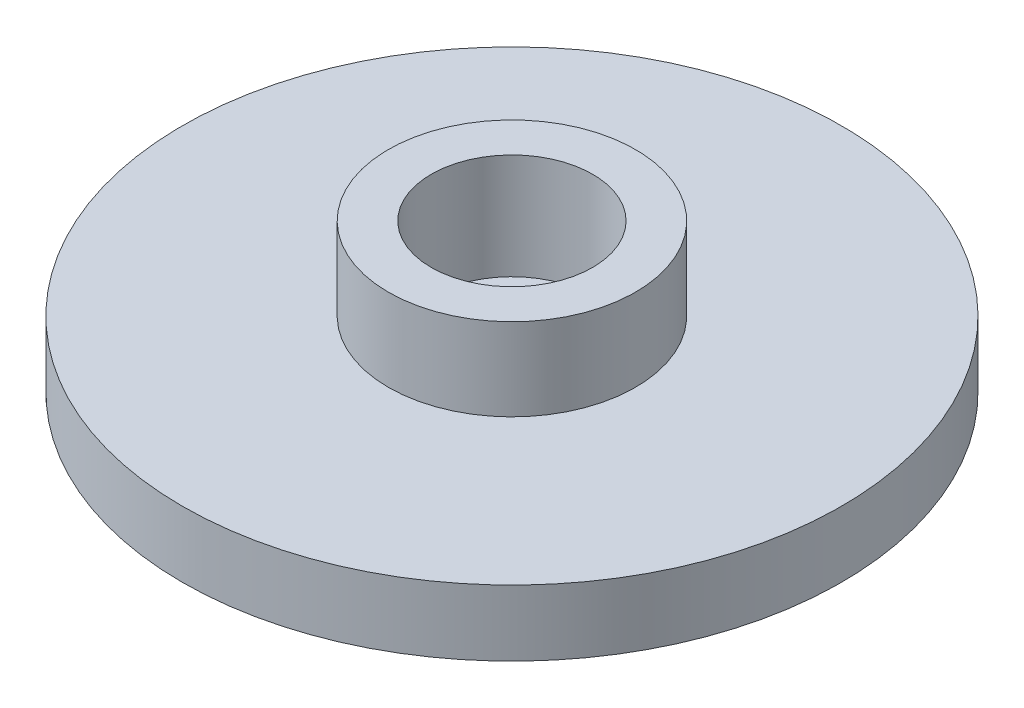
ISO-10303-21;
HEADER;
FILE_DESCRIPTION(('STEP AP214'),'2;1');
FILE_NAME('part.step','',(''),(''),'','','');
FILE_SCHEMA(('AUTOMOTIVE_DESIGN { 1 0 10303 214 1 1 1 1 }'));
ENDSEC;
DATA;
#1=APPLICATION_CONTEXT('core data for automotive mechanical design processes');
#2=APPLICATION_PROTOCOL_DEFINITION('international standard','automotive_design',2000,#1);
#3=PRODUCT_CONTEXT('',#1,'mechanical');
#4=PRODUCT('Part','Part','',(#3));
#5=PRODUCT_RELATED_PRODUCT_CATEGORY('part','',(#4));
#6=PRODUCT_DEFINITION_FORMATION('','',#4);
#7=PRODUCT_DEFINITION_CONTEXT('part definition',#1,'design');
#8=PRODUCT_DEFINITION('design','',#6,#7);
#9=PRODUCT_DEFINITION_SHAPE('','',#8);
#10=(LENGTH_UNIT() NAMED_UNIT(*) SI_UNIT(.MILLI.,.METRE.));
#11=(NAMED_UNIT(*) PLANE_ANGLE_UNIT() SI_UNIT($,.RADIAN.));
#12=(NAMED_UNIT(*) SI_UNIT($,.STERADIAN.) SOLID_ANGLE_UNIT());
#13=UNCERTAINTY_MEASURE_WITH_UNIT(LENGTH_MEASURE(1.E-05),#10,'distance_accuracy_value','');
#14=(GEOMETRIC_REPRESENTATION_CONTEXT(3) GLOBAL_UNCERTAINTY_ASSIGNED_CONTEXT((#13)) GLOBAL_UNIT_ASSIGNED_CONTEXT((#10,
#11,#12)) REPRESENTATION_CONTEXT('',''));
#15=CARTESIAN_POINT('',(0.,0.,0.));
#16=DIRECTION('',(0.,0.,1.));
#17=DIRECTION('',(1.,0.,0.));
#18=AXIS2_PLACEMENT_3D('',#15,#16,#17);
#19=CARTESIAN_POINT('',(0.,2.,0.));
#20=DIRECTION('',(0.,-1.,0.));
#21=DIRECTION('',(0.,0.,-1.));
#22=AXIS2_PLACEMENT_3D('',#19,#20,#21);
#23=CYLINDRICAL_SURFACE('',#22,1.25);
#24=CARTESIAN_POINT('',(0.,0.,0.));
#25=DIRECTION('',(0.,1.,0.));
#26=DIRECTION('',(0.,0.,1.));
#27=AXIS2_PLACEMENT_3D('',#24,#25,#26);
#28=CIRCLE('',#27,1.25);
#29=CARTESIAN_POINT('',(0.,0.,1.25));
#30=VERTEX_POINT('',#29);
#31=EDGE_CURVE('E56',#30,#30,#28,.T.);
#32=ORIENTED_EDGE('',*,*,#31,.F.);
#33=EDGE_LOOP('',(#32));
#34=FACE_BOUND('',#33,.T.);
#35=CARTESIAN_POINT('',(0.,1.3,0.));
#36=DIRECTION('',(0.,1.,0.));
#37=DIRECTION('',(0.,0.,1.));
#38=AXIS2_PLACEMENT_3D('',#35,#36,#37);
#39=CIRCLE('',#38,1.25);
#40=CARTESIAN_POINT('',(0.,1.3,1.25));
#41=VERTEX_POINT('',#40);
#42=EDGE_CURVE('E45',#41,#41,#39,.T.);
#43=ORIENTED_EDGE('',*,*,#42,.T.);
#44=EDGE_LOOP('',(#43));
#45=FACE_BOUND('',#44,.T.);
#46=ADVANCED_FACE('F41',(#34,#45),#23,.F.);
#47=CARTESIAN_POINT('',(0.,2.,0.));
#48=DIRECTION('',(0.,1.,0.));
#49=DIRECTION('',(0.,0.,1.));
#50=AXIS2_PLACEMENT_3D('',#47,#48,#49);
#51=PLANE('',#50);
#52=CARTESIAN_POINT('',(0.,2.,0.));
#53=DIRECTION('',(0.,1.,0.));
#54=DIRECTION('',(0.,0.,1.));
#55=AXIS2_PLACEMENT_3D('',#52,#53,#54);
#56=CIRCLE('',#55,3.75);
#57=CARTESIAN_POINT('',(0.,2.,3.75));
#58=VERTEX_POINT('',#57);
#59=EDGE_CURVE('E62',#58,#58,#56,.T.);
#60=ORIENTED_EDGE('',*,*,#59,.F.);
#61=EDGE_LOOP('',(#60));
#62=FACE_BOUND('',#61,.T.);
#63=CARTESIAN_POINT('',(0.,2.,0.));
#64=DIRECTION('',(0.,1.,0.));
#65=DIRECTION('',(0.,0.,1.));
#66=AXIS2_PLACEMENT_3D('',#63,#64,#65);
#67=CIRCLE('',#66,10.);
#68=CARTESIAN_POINT('',(0.,2.,10.));
#69=VERTEX_POINT('',#68);
#70=EDGE_CURVE('E10',#69,#69,#67,.T.);
#71=ORIENTED_EDGE('',*,*,#70,.T.);
#72=EDGE_LOOP('',(#71));
#73=FACE_BOUND('',#72,.T.);
#74=ADVANCED_FACE('F94',(#62,#73),#51,.T.);
#75=CARTESIAN_POINT('',(0.,0.,0.));
#76=DIRECTION('',(0.,1.,0.));
#77=DIRECTION('',(0.,0.,1.));
#78=AXIS2_PLACEMENT_3D('',#75,#76,#77);
#79=PLANE('',#78);
#80=CARTESIAN_POINT('',(0.,0.,0.));
#81=DIRECTION('',(0.,1.,0.));
#82=DIRECTION('',(0.,0.,1.));
#83=AXIS2_PLACEMENT_3D('',#80,#81,#82);
#84=CIRCLE('',#83,10.);
#85=CARTESIAN_POINT('',(0.,0.,10.));
#86=VERTEX_POINT('',#85);
#87=EDGE_CURVE('E50',#86,#86,#84,.T.);
#88=ORIENTED_EDGE('',*,*,#87,.F.);
#89=EDGE_LOOP('',(#88));
#90=FACE_BOUND('',#89,.T.);
#91=ORIENTED_EDGE('',*,*,#31,.T.);
#92=EDGE_LOOP('',(#91));
#93=FACE_BOUND('',#92,.T.);
#94=ADVANCED_FACE('F100',(#90,#93),#79,.F.);
#95=CARTESIAN_POINT('',(0.,2.,0.));
#96=DIRECTION('',(0.,-1.,0.));
#97=DIRECTION('',(0.,0.,-1.));
#98=AXIS2_PLACEMENT_3D('',#95,#96,#97);
#99=CYLINDRICAL_SURFACE('',#98,10.);
#100=ORIENTED_EDGE('',*,*,#70,.F.);
#101=EDGE_LOOP('',(#100));
#102=FACE_BOUND('',#101,.T.);
#103=ORIENTED_EDGE('',*,*,#87,.T.);
#104=EDGE_LOOP('',(#103));
#105=FACE_BOUND('',#104,.T.);
#106=ADVANCED_FACE('F43',(#102,#105),#99,.T.);
#107=CARTESIAN_POINT('',(0.,4.5,0.));
#108=DIRECTION('',(0.,-1.,0.));
#109=DIRECTION('',(0.,0.,-1.));
#110=AXIS2_PLACEMENT_3D('',#107,#108,#109);
#111=CYLINDRICAL_SURFACE('',#110,3.75);
#112=CARTESIAN_POINT('',(0.,4.5,0.));
#113=DIRECTION('',(0.,1.,0.));
#114=DIRECTION('',(0.,0.,1.));
#115=AXIS2_PLACEMENT_3D('',#112,#113,#114);
#116=CIRCLE('',#115,3.75);
#117=CARTESIAN_POINT('',(0.,4.5,3.75));
#118=VERTEX_POINT('',#117);
#119=EDGE_CURVE('E61',#118,#118,#116,.T.);
#120=ORIENTED_EDGE('',*,*,#119,.F.);
#121=EDGE_LOOP('',(#120));
#122=FACE_BOUND('',#121,.T.);
#123=ORIENTED_EDGE('',*,*,#59,.T.);
#124=EDGE_LOOP('',(#123));
#125=FACE_BOUND('',#124,.T.);
#126=ADVANCED_FACE('F105',(#122,#125),#111,.T.);
#127=CARTESIAN_POINT('',(0.,4.5,0.));
#128=DIRECTION('',(0.,1.,0.));
#129=DIRECTION('',(0.,0.,1.));
#130=AXIS2_PLACEMENT_3D('',#127,#128,#129);
#131=PLANE('',#130);
#132=CARTESIAN_POINT('',(0.,4.5,0.));
#133=DIRECTION('',(0.,1.,0.));
#134=DIRECTION('',(0.,0.,1.));
#135=AXIS2_PLACEMENT_3D('',#132,#133,#134);
#136=CIRCLE('',#135,2.45);
#137=CARTESIAN_POINT('',(0.,4.5,2.45));
#138=VERTEX_POINT('',#137);
#139=EDGE_CURVE('E69',#138,#138,#136,.T.);
#140=ORIENTED_EDGE('',*,*,#139,.F.);
#141=EDGE_LOOP('',(#140));
#142=FACE_BOUND('',#141,.T.);
#143=ORIENTED_EDGE('',*,*,#119,.T.);
#144=EDGE_LOOP('',(#143));
#145=FACE_BOUND('',#144,.T.);
#146=ADVANCED_FACE('F90',(#142,#145),#131,.T.);
#147=CARTESIAN_POINT('',(0.,1.3,0.));
#148=DIRECTION('',(0.,1.,0.));
#149=DIRECTION('',(0.,0.,1.));
#150=AXIS2_PLACEMENT_3D('',#147,#148,#149);
#151=CYLINDRICAL_SURFACE('',#150,2.45);
#152=CARTESIAN_POINT('',(0.,1.3,0.));
#153=DIRECTION('',(0.,1.,0.));
#154=DIRECTION('',(0.,0.,1.));
#155=AXIS2_PLACEMENT_3D('',#152,#153,#154);
#156=CIRCLE('',#155,2.45);
#157=CARTESIAN_POINT('',(0.,1.3,2.45));
#158=VERTEX_POINT('',#157);
#159=EDGE_CURVE('E73',#158,#158,#156,.T.);
#160=ORIENTED_EDGE('',*,*,#159,.F.);
#161=EDGE_LOOP('',(#160));
#162=FACE_BOUND('',#161,.T.);
#163=ORIENTED_EDGE('',*,*,#139,.T.);
#164=EDGE_LOOP('',(#163));
#165=FACE_BOUND('',#164,.T.);
#166=ADVANCED_FACE('F85',(#162,#165),#151,.F.);
#167=CARTESIAN_POINT('',(0.,1.3,0.));
#168=DIRECTION('',(0.,1.,0.));
#169=DIRECTION('',(0.,0.,1.));
#170=AXIS2_PLACEMENT_3D('',#167,#168,#169);
#171=PLANE('',#170);
#172=ORIENTED_EDGE('',*,*,#42,.F.);
#173=EDGE_LOOP('',(#172));
#174=FACE_BOUND('',#173,.T.);
#175=ORIENTED_EDGE('',*,*,#159,.T.);
#176=EDGE_LOOP('',(#175));
#177=FACE_BOUND('',#176,.T.);
#178=ADVANCED_FACE('F83',(#174,#177),#171,.T.);
#179=CLOSED_SHELL('',(#46,#74,#94,#106,#126,#146,#166,#178));
#180=MANIFOLD_SOLID_BREP('B2',#179);
#181=ADVANCED_BREP_SHAPE_REPRESENTATION('',(#18,#180),#14);
#182=SHAPE_DEFINITION_REPRESENTATION(#9,#181);
ENDSEC;
END-ISO-10303-21;
